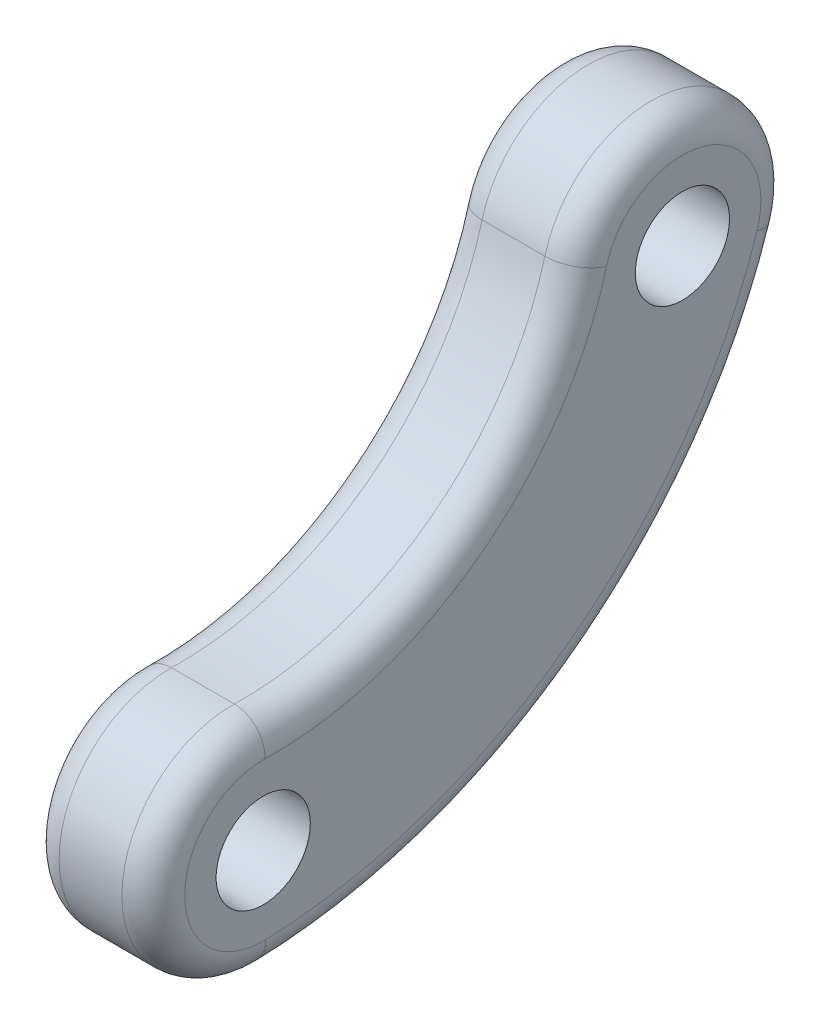
ISO-10303-21;
HEADER;
FILE_DESCRIPTION(('STEP AP214'),'2;1');
FILE_NAME('part.step','',(''),(''),'','','');
FILE_SCHEMA(('AUTOMOTIVE_DESIGN { 1 0 10303 214 1 1 1 1 }'));
ENDSEC;
DATA;
#1=APPLICATION_CONTEXT('core data for automotive mechanical design processes');
#2=APPLICATION_PROTOCOL_DEFINITION('international standard','automotive_design',2000,#1);
#3=PRODUCT_CONTEXT('',#1,'mechanical');
#4=PRODUCT('Part','Part','',(#3));
#5=PRODUCT_RELATED_PRODUCT_CATEGORY('part','',(#4));
#6=PRODUCT_DEFINITION_FORMATION('','',#4);
#7=PRODUCT_DEFINITION_CONTEXT('part definition',#1,'design');
#8=PRODUCT_DEFINITION('design','',#6,#7);
#9=PRODUCT_DEFINITION_SHAPE('','',#8);
#10=(LENGTH_UNIT() NAMED_UNIT(*) SI_UNIT(.MILLI.,.METRE.));
#11=(NAMED_UNIT(*) PLANE_ANGLE_UNIT() SI_UNIT($,.RADIAN.));
#12=(NAMED_UNIT(*) SI_UNIT($,.STERADIAN.) SOLID_ANGLE_UNIT());
#13=UNCERTAINTY_MEASURE_WITH_UNIT(LENGTH_MEASURE(1.E-05),#10,'distance_accuracy_value','');
#14=(GEOMETRIC_REPRESENTATION_CONTEXT(3) GLOBAL_UNCERTAINTY_ASSIGNED_CONTEXT((#13)) GLOBAL_UNIT_ASSIGNED_CONTEXT((#10,
#11,#12)) REPRESENTATION_CONTEXT('',''));
#15=CARTESIAN_POINT('',(0.,0.,0.));
#16=DIRECTION('',(0.,0.,1.));
#17=DIRECTION('',(1.,0.,0.));
#18=AXIS2_PLACEMENT_3D('',#15,#16,#17);
#19=CARTESIAN_POINT('',(40.,22.4671889286241,68.9309467630143));
#20=DIRECTION('',(1.,0.,0.));
#21=DIRECTION('',(0.,0.,-1.));
#22=AXIS2_PLACEMENT_3D('',#19,#20,#21);
#23=PLANE('',#22);
#24=CARTESIAN_POINT('',(40.,44.9343778572482,137.861893526029));
#25=DIRECTION('',(1.,0.,0.));
#26=DIRECTION('',(0.,0.,-1.));
#27=AXIS2_PLACEMENT_3D('',#24,#25,#26);
#28=CIRCLE('',#27,170.);
#29=CARTESIAN_POINT('',(40.,-124.988685837457,132.747949392064));
#30=VERTEX_POINT('',#29);
#31=CARTESIAN_POINT('',(40.,-7.74730652711176,-23.7692919872463));
#32=VERTEX_POINT('',#31);
#33=EDGE_CURVE('E53',#30,#32,#28,.T.);
#34=ORIENTED_EDGE('',*,*,#33,.T.);
#35=CARTESIAN_POINT('',(40.,0.,0.));
#36=DIRECTION('',(1.,0.,0.));
#37=DIRECTION('',(0.,0.,-1.));
#38=AXIS2_PLACEMENT_3D('',#35,#36,#37);
#39=CIRCLE('',#38,25.);
#40=CARTESIAN_POINT('',(40.,6.47486230187005,24.146969958399));
#41=VERTEX_POINT('',#40);
#42=EDGE_CURVE('E112',#32,#41,#39,.T.);
#43=ORIENTED_EDGE('',*,*,#42,.T.);
#44=CARTESIAN_POINT('',(40.,34.9642564300982,130.393637775354));
#45=DIRECTION('',(1.,0.,0.));
#46=DIRECTION('',(0.,0.,-1.));
#47=AXIS2_PLACEMENT_3D('',#44,#45,#46);
#48=CIRCLE('',#47,110.);
#49=CARTESIAN_POINT('',(40.,-75.0066191796114,132.924747736177));
#50=VERTEX_POINT('',#49);
#51=EDGE_CURVE('E135',#41,#50,#48,.F.);
#52=ORIENTED_EDGE('',*,*,#51,.T.);
#53=CARTESIAN_POINT('',(40.,-100.,133.5));
#54=DIRECTION('',(1.,0.,0.));
#55=DIRECTION('',(0.,0.,-1.));
#56=AXIS2_PLACEMENT_3D('',#53,#54,#55);
#57=CIRCLE('',#56,25.);
#58=EDGE_CURVE('E58',#50,#30,#57,.T.);
#59=ORIENTED_EDGE('',*,*,#58,.T.);
#60=EDGE_LOOP('',(#34,#43,#52,#59));
#61=FACE_BOUND('',#60,.T.);
#62=CARTESIAN_POINT('',(40.,0.,0.));
#63=DIRECTION('',(1.,0.,0.));
#64=DIRECTION('',(0.,0.,-1.));
#65=AXIS2_PLACEMENT_3D('',#62,#63,#64);
#66=CIRCLE('',#65,15.);
#67=CARTESIAN_POINT('',(40.,0.,-15.));
#68=VERTEX_POINT('',#67);
#69=EDGE_CURVE('E172',#68,#68,#66,.T.);
#70=ORIENTED_EDGE('',*,*,#69,.F.);
#71=EDGE_LOOP('',(#70));
#72=FACE_BOUND('',#71,.T.);
#73=CARTESIAN_POINT('',(40.,-100.,133.5));
#74=DIRECTION('',(1.,0.,0.));
#75=DIRECTION('',(0.,0.,-1.));
#76=AXIS2_PLACEMENT_3D('',#73,#74,#75);
#77=CIRCLE('',#76,15.);
#78=CARTESIAN_POINT('',(40.,-100.,118.5));
#79=VERTEX_POINT('',#78);
#80=EDGE_CURVE('E164',#79,#79,#77,.T.);
#81=ORIENTED_EDGE('',*,*,#80,.F.);
#82=EDGE_LOOP('',(#81));
#83=FACE_BOUND('',#82,.T.);
#84=ADVANCED_FACE('F36',(#61,#72,#83),#23,.T.);
#85=CARTESIAN_POINT('',(0.,22.4671889286241,68.9309467630143));
#86=DIRECTION('',(1.,0.,0.));
#87=DIRECTION('',(0.,0.,-1.));
#88=AXIS2_PLACEMENT_3D('',#85,#86,#87);
#89=PLANE('',#88);
#90=CARTESIAN_POINT('',(0.,34.9642564300982,130.393637775354));
#91=DIRECTION('',(1.,0.,0.));
#92=DIRECTION('',(0.,0.,-1.));
#93=AXIS2_PLACEMENT_3D('',#90,#91,#92);
#94=CIRCLE('',#93,110.);
#95=CARTESIAN_POINT('',(0.,-75.0066191796114,132.924747736177));
#96=VERTEX_POINT('',#95);
#97=CARTESIAN_POINT('',(0.,6.47486230187005,24.146969958399));
#98=VERTEX_POINT('',#97);
#99=EDGE_CURVE('E183',#96,#98,#94,.T.);
#100=ORIENTED_EDGE('',*,*,#99,.T.);
#101=CARTESIAN_POINT('',(0.,0.,0.));
#102=DIRECTION('',(1.,0.,0.));
#103=DIRECTION('',(0.,0.,-1.));
#104=AXIS2_PLACEMENT_3D('',#101,#102,#103);
#105=CIRCLE('',#104,25.);
#106=CARTESIAN_POINT('',(0.,-7.74730652711176,-23.7692919872463));
#107=VERTEX_POINT('',#106);
#108=EDGE_CURVE('E189',#98,#107,#105,.F.);
#109=ORIENTED_EDGE('',*,*,#108,.T.);
#110=CARTESIAN_POINT('',(0.,44.9343778572482,137.861893526029));
#111=DIRECTION('',(1.,0.,0.));
#112=DIRECTION('',(0.,0.,-1.));
#113=AXIS2_PLACEMENT_3D('',#110,#111,#112);
#114=CIRCLE('',#113,170.);
#115=CARTESIAN_POINT('',(0.,-124.988685837457,132.747949392064));
#116=VERTEX_POINT('',#115);
#117=EDGE_CURVE('E187',#107,#116,#114,.F.);
#118=ORIENTED_EDGE('',*,*,#117,.T.);
#119=CARTESIAN_POINT('',(0.,-100.,133.5));
#120=DIRECTION('',(1.,0.,0.));
#121=DIRECTION('',(0.,0.,-1.));
#122=AXIS2_PLACEMENT_3D('',#119,#120,#121);
#123=CIRCLE('',#122,25.);
#124=EDGE_CURVE('E185',#116,#96,#123,.F.);
#125=ORIENTED_EDGE('',*,*,#124,.T.);
#126=EDGE_LOOP('',(#100,#109,#118,#125));
#127=FACE_BOUND('',#126,.T.);
#128=CARTESIAN_POINT('',(0.,0.,0.));
#129=DIRECTION('',(1.,0.,0.));
#130=DIRECTION('',(0.,0.,-1.));
#131=AXIS2_PLACEMENT_3D('',#128,#129,#130);
#132=CIRCLE('',#131,15.);
#133=CARTESIAN_POINT('',(0.,0.,-15.));
#134=VERTEX_POINT('',#133);
#135=EDGE_CURVE('E169',#134,#134,#132,.T.);
#136=ORIENTED_EDGE('',*,*,#135,.T.);
#137=EDGE_LOOP('',(#136));
#138=FACE_BOUND('',#137,.T.);
#139=CARTESIAN_POINT('',(0.,-100.,133.5));
#140=DIRECTION('',(1.,0.,0.));
#141=DIRECTION('',(0.,0.,-1.));
#142=AXIS2_PLACEMENT_3D('',#139,#140,#141);
#143=CIRCLE('',#142,15.);
#144=CARTESIAN_POINT('',(0.,-100.,118.5));
#145=VERTEX_POINT('',#144);
#146=EDGE_CURVE('E158',#145,#145,#143,.T.);
#147=ORIENTED_EDGE('',*,*,#146,.T.);
#148=EDGE_LOOP('',(#147));
#149=FACE_BOUND('',#148,.T.);
#150=ADVANCED_FACE('F229',(#127,#138,#149),#89,.F.);
#151=CARTESIAN_POINT('',(40.,44.9343778572482,137.861893526029));
#152=DIRECTION('',(-1.,0.,0.));
#153=DIRECTION('',(0.,0.,1.));
#154=AXIS2_PLACEMENT_3D('',#151,#152,#153);
#155=CYLINDRICAL_SURFACE('',#154,180.);
#156=DIRECTION('',(-1.,0.,0.));
#157=VECTOR('',#156,1.);
#158=CARTESIAN_POINT('',(40.,-134.984160172439,132.44712914889));
#159=LINE('',#158,#157);
#160=CARTESIAN_POINT('',(30.,-134.984160172439,132.44712914889));
#161=VERTEX_POINT('',#160);
#162=CARTESIAN_POINT('',(10.,-134.984160172439,132.44712914889));
#163=VERTEX_POINT('',#162);
#164=EDGE_CURVE('E175',#161,#163,#159,.T.);
#165=ORIENTED_EDGE('',*,*,#164,.T.);
#166=CARTESIAN_POINT('',(10.,44.9343778572482,137.861893526029));
#167=DIRECTION('',(1.,0.,0.));
#168=DIRECTION('',(0.,0.,-1.));
#169=AXIS2_PLACEMENT_3D('',#166,#167,#168);
#170=CIRCLE('',#169,180.);
#171=CARTESIAN_POINT('',(10.,-10.8462291379565,-33.2770087821448));
#172=VERTEX_POINT('',#171);
#173=EDGE_CURVE('E194',#163,#172,#170,.T.);
#174=ORIENTED_EDGE('',*,*,#173,.T.);
#175=DIRECTION('',(-1.,0.,0.));
#176=VECTOR('',#175,1.);
#177=CARTESIAN_POINT('',(40.,-10.8462291379565,-33.2770087821448));
#178=LINE('',#177,#176);
#179=CARTESIAN_POINT('',(30.,-10.8462291379565,-33.2770087821448));
#180=VERTEX_POINT('',#179);
#181=EDGE_CURVE('E124',#180,#172,#178,.T.);
#182=ORIENTED_EDGE('',*,*,#181,.F.);
#183=CARTESIAN_POINT('',(30.,44.9343778572482,137.861893526029));
#184=DIRECTION('',(1.,0.,0.));
#185=DIRECTION('',(0.,0.,-1.));
#186=AXIS2_PLACEMENT_3D('',#183,#184,#185);
#187=CIRCLE('',#186,180.);
#188=EDGE_CURVE('E192',#180,#161,#187,.F.);
#189=ORIENTED_EDGE('',*,*,#188,.T.);
#190=EDGE_LOOP('',(#165,#174,#182,#189));
#191=FACE_BOUND('',#190,.T.);
#192=ADVANCED_FACE('F209',(#191),#155,.T.);
#193=CARTESIAN_POINT('',(40.,0.,0.));
#194=DIRECTION('',(-1.,0.,0.));
#195=DIRECTION('',(0.,0.,1.));
#196=AXIS2_PLACEMENT_3D('',#193,#194,#195);
#197=CYLINDRICAL_SURFACE('',#196,35.);
#198=ORIENTED_EDGE('',*,*,#181,.T.);
#199=CARTESIAN_POINT('',(10.,0.,0.));
#200=DIRECTION('',(1.,0.,0.));
#201=DIRECTION('',(0.,0.,-1.));
#202=AXIS2_PLACEMENT_3D('',#199,#200,#201);
#203=CIRCLE('',#202,35.);
#204=CARTESIAN_POINT('',(10.,9.06480722261807,33.8057579417586));
#205=VERTEX_POINT('',#204);
#206=EDGE_CURVE('E123',#172,#205,#203,.T.);
#207=ORIENTED_EDGE('',*,*,#206,.T.);
#208=DIRECTION('',(-1.,0.,0.));
#209=VECTOR('',#208,1.);
#210=CARTESIAN_POINT('',(40.,9.06480722261807,33.8057579417586));
#211=LINE('',#210,#209);
#212=CARTESIAN_POINT('',(30.,9.06480722261807,33.8057579417586));
#213=VERTEX_POINT('',#212);
#214=EDGE_CURVE('E105',#213,#205,#211,.T.);
#215=ORIENTED_EDGE('',*,*,#214,.F.);
#216=CARTESIAN_POINT('',(30.,0.,0.));
#217=DIRECTION('',(1.,0.,0.));
#218=DIRECTION('',(0.,0.,-1.));
#219=AXIS2_PLACEMENT_3D('',#216,#217,#218);
#220=CIRCLE('',#219,35.);
#221=EDGE_CURVE('E120',#213,#180,#220,.F.);
#222=ORIENTED_EDGE('',*,*,#221,.T.);
#223=EDGE_LOOP('',(#198,#207,#215,#222));
#224=FACE_BOUND('',#223,.T.);
#225=ADVANCED_FACE('F119',(#224),#197,.T.);
#226=CARTESIAN_POINT('',(40.,34.9642564300982,130.393637775354));
#227=DIRECTION('',(-1.,0.,0.));
#228=DIRECTION('',(0.,0.,1.));
#229=AXIS2_PLACEMENT_3D('',#226,#227,#228);
#230=CYLINDRICAL_SURFACE('',#229,100.);
#231=ORIENTED_EDGE('',*,*,#214,.T.);
#232=CARTESIAN_POINT('',(10.,34.9642564300982,130.393637775354));
#233=DIRECTION('',(1.,0.,0.));
#234=DIRECTION('',(0.,0.,-1.));
#235=AXIS2_PLACEMENT_3D('',#232,#233,#234);
#236=CIRCLE('',#235,100.);
#237=CARTESIAN_POINT('',(10.,-65.009266851456,132.694646830647));
#238=VERTEX_POINT('',#237);
#239=EDGE_CURVE('E11',#205,#238,#236,.F.);
#240=ORIENTED_EDGE('',*,*,#239,.T.);
#241=DIRECTION('',(-1.,0.,0.));
#242=VECTOR('',#241,1.);
#243=CARTESIAN_POINT('',(40.,-65.009266851456,132.694646830647));
#244=LINE('',#243,#242);
#245=CARTESIAN_POINT('',(30.,-65.009266851456,132.694646830647));
#246=VERTEX_POINT('',#245);
#247=EDGE_CURVE('E107',#246,#238,#244,.T.);
#248=ORIENTED_EDGE('',*,*,#247,.F.);
#249=CARTESIAN_POINT('',(30.,34.9642564300982,130.393637775354));
#250=DIRECTION('',(1.,0.,0.));
#251=DIRECTION('',(0.,0.,-1.));
#252=AXIS2_PLACEMENT_3D('',#249,#250,#251);
#253=CIRCLE('',#252,100.);
#254=EDGE_CURVE('E45',#246,#213,#253,.T.);
#255=ORIENTED_EDGE('',*,*,#254,.T.);
#256=EDGE_LOOP('',(#231,#240,#248,#255));
#257=FACE_BOUND('',#256,.T.);
#258=ADVANCED_FACE('F104',(#257),#230,.F.);
#259=CARTESIAN_POINT('',(40.,-100.,133.5));
#260=DIRECTION('',(-1.,0.,0.));
#261=DIRECTION('',(0.,0.,1.));
#262=AXIS2_PLACEMENT_3D('',#259,#260,#261);
#263=CYLINDRICAL_SURFACE('',#262,35.);
#264=ORIENTED_EDGE('',*,*,#247,.T.);
#265=CARTESIAN_POINT('',(10.,-100.,133.5));
#266=DIRECTION('',(1.,0.,0.));
#267=DIRECTION('',(0.,0.,-1.));
#268=AXIS2_PLACEMENT_3D('',#265,#266,#267);
#269=CIRCLE('',#268,35.);
#270=EDGE_CURVE('E198',#238,#163,#269,.T.);
#271=ORIENTED_EDGE('',*,*,#270,.T.);
#272=ORIENTED_EDGE('',*,*,#164,.F.);
#273=CARTESIAN_POINT('',(30.,-100.,133.5));
#274=DIRECTION('',(1.,0.,0.));
#275=DIRECTION('',(0.,0.,-1.));
#276=AXIS2_PLACEMENT_3D('',#273,#274,#275);
#277=CIRCLE('',#276,35.);
#278=EDGE_CURVE('E196',#161,#246,#277,.F.);
#279=ORIENTED_EDGE('',*,*,#278,.T.);
#280=EDGE_LOOP('',(#264,#271,#272,#279));
#281=FACE_BOUND('',#280,.T.);
#282=ADVANCED_FACE('F211',(#281),#263,.T.);
#283=CARTESIAN_POINT('',(40.,0.,0.));
#284=DIRECTION('',(-1.,0.,0.));
#285=DIRECTION('',(0.,0.,1.));
#286=AXIS2_PLACEMENT_3D('',#283,#284,#285);
#287=CYLINDRICAL_SURFACE('',#286,15.);
#288=ORIENTED_EDGE('',*,*,#69,.T.);
#289=EDGE_LOOP('',(#288));
#290=FACE_BOUND('',#289,.T.);
#291=ORIENTED_EDGE('',*,*,#135,.F.);
#292=EDGE_LOOP('',(#291));
#293=FACE_BOUND('',#292,.T.);
#294=ADVANCED_FACE('F237',(#290,#293),#287,.F.);
#295=CARTESIAN_POINT('',(40.,-100.,133.5));
#296=DIRECTION('',(-1.,0.,0.));
#297=DIRECTION('',(0.,0.,1.));
#298=AXIS2_PLACEMENT_3D('',#295,#296,#297);
#299=CYLINDRICAL_SURFACE('',#298,15.);
#300=ORIENTED_EDGE('',*,*,#80,.T.);
#301=EDGE_LOOP('',(#300));
#302=FACE_BOUND('',#301,.T.);
#303=ORIENTED_EDGE('',*,*,#146,.F.);
#304=EDGE_LOOP('',(#303));
#305=FACE_BOUND('',#304,.T.);
#306=ADVANCED_FACE('F269',(#302,#305),#299,.F.);
#307=CARTESIAN_POINT('',(10.,-100.,133.5));
#308=DIRECTION('',(1.,0.,0.));
#309=DIRECTION('',(0.,0.,-1.));
#310=AXIS2_PLACEMENT_3D('',#307,#308,#309);
#311=TOROIDAL_SURFACE('',#310,25.,10.);
#312=CARTESIAN_POINT('',(10.,-75.0066191796114,132.924747736177));
#313=DIRECTION('',(0.,-0.0230100905529301,-0.999735232815542));
#314=DIRECTION('',(0.,0.999735232815542,-0.0230100905529301));
#315=AXIS2_PLACEMENT_3D('',#312,#313,#314);
#316=CIRCLE('',#315,10.);
#317=EDGE_CURVE('E151',#96,#238,#316,.T.);
#318=ORIENTED_EDGE('',*,*,#317,.F.);
#319=ORIENTED_EDGE('',*,*,#124,.F.);
#320=CARTESIAN_POINT('',(10.,-124.988685837457,132.747949392064));
#321=DIRECTION('',(0.,0.0300820243174377,-0.999547433498263));
#322=DIRECTION('',(0.,0.999547433498263,0.0300820243174377));
#323=AXIS2_PLACEMENT_3D('',#320,#321,#322);
#324=CIRCLE('',#323,10.);
#325=EDGE_CURVE('E140',#163,#116,#324,.T.);
#326=ORIENTED_EDGE('',*,*,#325,.F.);
#327=ORIENTED_EDGE('',*,*,#270,.F.);
#328=EDGE_LOOP('',(#318,#319,#326,#327));
#329=FACE_BOUND('',#328,.T.);
#330=ADVANCED_FACE('F214',(#329),#311,.T.);
#331=CARTESIAN_POINT('',(10.,44.9343778572482,137.861893526029));
#332=DIRECTION('',(1.,0.,0.));
#333=DIRECTION('',(0.,0.,-1.));
#334=AXIS2_PLACEMENT_3D('',#331,#332,#333);
#335=TOROIDAL_SURFACE('',#334,170.,10.);
#336=ORIENTED_EDGE('',*,*,#325,.T.);
#337=ORIENTED_EDGE('',*,*,#117,.F.);
#338=CARTESIAN_POINT('',(10.,-7.74730652711176,-23.7692919872463));
#339=DIRECTION('',(0.,0.950771679489852,-0.30989226108447));
#340=DIRECTION('',(0.,0.30989226108447,0.950771679489853));
#341=AXIS2_PLACEMENT_3D('',#338,#339,#340);
#342=CIRCLE('',#341,10.);
#343=EDGE_CURVE('E145',#172,#107,#342,.T.);
#344=ORIENTED_EDGE('',*,*,#343,.F.);
#345=ORIENTED_EDGE('',*,*,#173,.F.);
#346=EDGE_LOOP('',(#336,#337,#344,#345));
#347=FACE_BOUND('',#346,.T.);
#348=ADVANCED_FACE('F217',(#347),#335,.T.);
#349=CARTESIAN_POINT('',(10.,34.9642564300982,130.393637775354));
#350=DIRECTION('',(1.,0.,0.));
#351=DIRECTION('',(0.,0.,-1.));
#352=AXIS2_PLACEMENT_3D('',#349,#350,#351);
#353=TOROIDAL_SURFACE('',#352,110.,10.);
#354=ORIENTED_EDGE('',*,*,#317,.T.);
#355=ORIENTED_EDGE('',*,*,#239,.F.);
#356=CARTESIAN_POINT('',(10.,6.47486230187005,24.146969958399));
#357=DIRECTION('',(0.,0.965878798335959,-0.258994492074802));
#358=DIRECTION('',(0.,0.258994492074802,0.965878798335959));
#359=AXIS2_PLACEMENT_3D('',#356,#357,#358);
#360=CIRCLE('',#359,10.);
#361=EDGE_CURVE('E143',#98,#205,#360,.T.);
#362=ORIENTED_EDGE('',*,*,#361,.F.);
#363=ORIENTED_EDGE('',*,*,#99,.F.);
#364=EDGE_LOOP('',(#354,#355,#362,#363));
#365=FACE_BOUND('',#364,.T.);
#366=ADVANCED_FACE('F220',(#365),#353,.T.);
#367=CARTESIAN_POINT('',(10.,0.,0.));
#368=DIRECTION('',(1.,0.,0.));
#369=DIRECTION('',(0.,0.,-1.));
#370=AXIS2_PLACEMENT_3D('',#367,#368,#369);
#371=TOROIDAL_SURFACE('',#370,25.,10.);
#372=ORIENTED_EDGE('',*,*,#343,.T.);
#373=ORIENTED_EDGE('',*,*,#108,.F.);
#374=ORIENTED_EDGE('',*,*,#361,.T.);
#375=ORIENTED_EDGE('',*,*,#206,.F.);
#376=EDGE_LOOP('',(#372,#373,#374,#375));
#377=FACE_BOUND('',#376,.T.);
#378=ADVANCED_FACE('F218',(#377),#371,.T.);
#379=CARTESIAN_POINT('',(30.,-100.,133.5));
#380=DIRECTION('',(1.,0.,0.));
#381=DIRECTION('',(0.,0.,-1.));
#382=AXIS2_PLACEMENT_3D('',#379,#380,#381);
#383=TOROIDAL_SURFACE('',#382,25.,10.);
#384=CARTESIAN_POINT('',(30.,-75.0066191796114,132.924747736177));
#385=DIRECTION('',(0.,-0.0230100905529301,-0.999735232815542));
#386=DIRECTION('',(0.,0.999735232815542,-0.0230100905529301));
#387=AXIS2_PLACEMENT_3D('',#384,#385,#386);
#388=CIRCLE('',#387,10.);
#389=EDGE_CURVE('E137',#246,#50,#388,.T.);
#390=ORIENTED_EDGE('',*,*,#389,.F.);
#391=ORIENTED_EDGE('',*,*,#278,.F.);
#392=CARTESIAN_POINT('',(30.,-124.988685837457,132.747949392064));
#393=DIRECTION('',(0.,0.0300820243174377,-0.999547433498263));
#394=DIRECTION('',(0.,0.999547433498263,0.0300820243174377));
#395=AXIS2_PLACEMENT_3D('',#392,#393,#394);
#396=CIRCLE('',#395,10.);
#397=EDGE_CURVE('E40',#30,#161,#396,.T.);
#398=ORIENTED_EDGE('',*,*,#397,.F.);
#399=ORIENTED_EDGE('',*,*,#58,.F.);
#400=EDGE_LOOP('',(#390,#391,#398,#399));
#401=FACE_BOUND('',#400,.T.);
#402=ADVANCED_FACE('F38',(#401),#383,.T.);
#403=CARTESIAN_POINT('',(30.,44.9343778572482,137.861893526029));
#404=DIRECTION('',(1.,0.,0.));
#405=DIRECTION('',(0.,0.,-1.));
#406=AXIS2_PLACEMENT_3D('',#403,#404,#405);
#407=TOROIDAL_SURFACE('',#406,170.,10.);
#408=ORIENTED_EDGE('',*,*,#397,.T.);
#409=ORIENTED_EDGE('',*,*,#188,.F.);
#410=CARTESIAN_POINT('',(30.,-7.74730652711176,-23.7692919872463));
#411=DIRECTION('',(0.,0.950771679489852,-0.30989226108447));
#412=DIRECTION('',(0.,0.30989226108447,0.950771679489853));
#413=AXIS2_PLACEMENT_3D('',#410,#411,#412);
#414=CIRCLE('',#413,10.);
#415=EDGE_CURVE('E131',#32,#180,#414,.T.);
#416=ORIENTED_EDGE('',*,*,#415,.F.);
#417=ORIENTED_EDGE('',*,*,#33,.F.);
#418=EDGE_LOOP('',(#408,#409,#416,#417));
#419=FACE_BOUND('',#418,.T.);
#420=ADVANCED_FACE('F206',(#419),#407,.T.);
#421=CARTESIAN_POINT('',(30.,34.9642564300982,130.393637775354));
#422=DIRECTION('',(1.,0.,0.));
#423=DIRECTION('',(0.,0.,-1.));
#424=AXIS2_PLACEMENT_3D('',#421,#422,#423);
#425=TOROIDAL_SURFACE('',#424,110.,10.);
#426=ORIENTED_EDGE('',*,*,#389,.T.);
#427=ORIENTED_EDGE('',*,*,#51,.F.);
#428=CARTESIAN_POINT('',(30.,6.47486230187005,24.146969958399));
#429=DIRECTION('',(0.,0.965878798335959,-0.258994492074801));
#430=DIRECTION('',(0.,0.258994492074801,0.965878798335959));
#431=AXIS2_PLACEMENT_3D('',#428,#429,#430);
#432=CIRCLE('',#431,10.);
#433=EDGE_CURVE('E129',#213,#41,#432,.T.);
#434=ORIENTED_EDGE('',*,*,#433,.F.);
#435=ORIENTED_EDGE('',*,*,#254,.F.);
#436=EDGE_LOOP('',(#426,#427,#434,#435));
#437=FACE_BOUND('',#436,.T.);
#438=ADVANCED_FACE('F134',(#437),#425,.T.);
#439=CARTESIAN_POINT('',(30.,0.,0.));
#440=DIRECTION('',(1.,0.,0.));
#441=DIRECTION('',(0.,0.,-1.));
#442=AXIS2_PLACEMENT_3D('',#439,#440,#441);
#443=TOROIDAL_SURFACE('',#442,25.,10.);
#444=ORIENTED_EDGE('',*,*,#415,.T.);
#445=ORIENTED_EDGE('',*,*,#221,.F.);
#446=ORIENTED_EDGE('',*,*,#433,.T.);
#447=ORIENTED_EDGE('',*,*,#42,.F.);
#448=EDGE_LOOP('',(#444,#445,#446,#447));
#449=FACE_BOUND('',#448,.T.);
#450=ADVANCED_FACE('F127',(#449),#443,.T.);
#451=CLOSED_SHELL('',(#84,#150,#192,#225,#258,#282,#294,#306,#330,#348,#366,#378,#402,#420,#438,#450));
#452=MANIFOLD_SOLID_BREP('B2',#451);
#453=ADVANCED_BREP_SHAPE_REPRESENTATION('',(#18,#452),#14);
#454=SHAPE_DEFINITION_REPRESENTATION(#9,#453);
ENDSEC;
END-ISO-10303-21;
